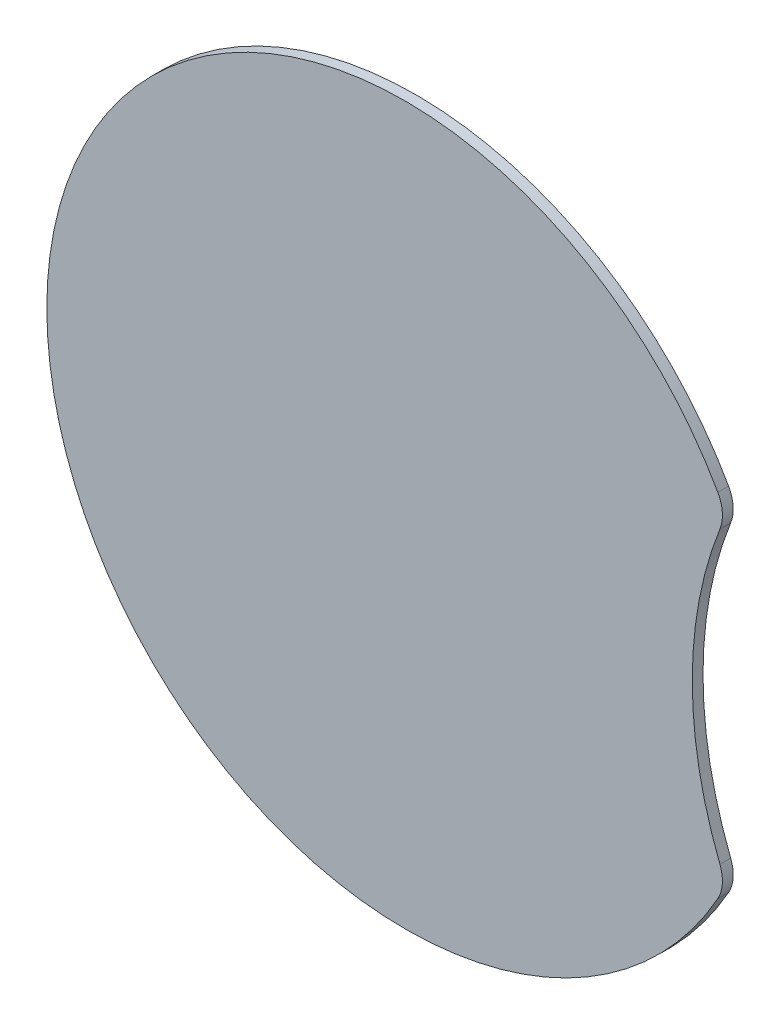
ISO-10303-21;
HEADER;
FILE_DESCRIPTION(('STEP AP214'),'2;1');
FILE_NAME('part.step','',(''),(''),'','','');
FILE_SCHEMA(('AUTOMOTIVE_DESIGN { 1 0 10303 214 1 1 1 1 }'));
ENDSEC;
DATA;
#1=APPLICATION_CONTEXT('core data for automotive mechanical design processes');
#2=APPLICATION_PROTOCOL_DEFINITION('international standard','automotive_design',2000,#1);
#3=PRODUCT_CONTEXT('',#1,'mechanical');
#4=PRODUCT('Part','Part','',(#3));
#5=PRODUCT_RELATED_PRODUCT_CATEGORY('part','',(#4));
#6=PRODUCT_DEFINITION_FORMATION('','',#4);
#7=PRODUCT_DEFINITION_CONTEXT('part definition',#1,'design');
#8=PRODUCT_DEFINITION('design','',#6,#7);
#9=PRODUCT_DEFINITION_SHAPE('','',#8);
#10=(LENGTH_UNIT() NAMED_UNIT(*) SI_UNIT(.MILLI.,.METRE.));
#11=(NAMED_UNIT(*) PLANE_ANGLE_UNIT() SI_UNIT($,.RADIAN.));
#12=(NAMED_UNIT(*) SI_UNIT($,.STERADIAN.) SOLID_ANGLE_UNIT());
#13=UNCERTAINTY_MEASURE_WITH_UNIT(LENGTH_MEASURE(1.E-05),#10,'distance_accuracy_value','');
#14=(GEOMETRIC_REPRESENTATION_CONTEXT(3) GLOBAL_UNCERTAINTY_ASSIGNED_CONTEXT((#13)) GLOBAL_UNIT_ASSIGNED_CONTEXT((#10,
#11,#12)) REPRESENTATION_CONTEXT('',''));
#15=CARTESIAN_POINT('',(0.,0.,0.));
#16=DIRECTION('',(0.,0.,1.));
#17=DIRECTION('',(1.,0.,0.));
#18=AXIS2_PLACEMENT_3D('',#15,#16,#17);
#19=CARTESIAN_POINT('',(0.,0.,3.));
#20=DIRECTION('',(0.,0.,-1.));
#21=DIRECTION('',(-1.,0.,0.));
#22=AXIS2_PLACEMENT_3D('',#19,#20,#21);
#23=CYLINDRICAL_SURFACE('',#22,100.);
#24=CARTESIAN_POINT('',(0.,0.,0.));
#25=DIRECTION('',(0.,0.,1.));
#26=DIRECTION('',(1.,0.,0.));
#27=AXIS2_PLACEMENT_3D('',#24,#25,#26);
#28=CIRCLE('',#27,100.);
#29=CARTESIAN_POINT('',(87.1345029239766,49.0670806161475,0.));
#30=VERTEX_POINT('',#29);
#31=CARTESIAN_POINT('',(87.1345029239766,-49.0670806161475,0.));
#32=VERTEX_POINT('',#31);
#33=EDGE_CURVE('E80',#30,#32,#28,.T.);
#34=ORIENTED_EDGE('',*,*,#33,.T.);
#35=DIRECTION('',(0.,0.,-1.));
#36=VECTOR('',#35,1.);
#37=CARTESIAN_POINT('',(87.1345029239766,-49.0670806161475,3.));
#38=LINE('',#37,#36);
#39=CARTESIAN_POINT('',(87.1345029239766,-49.0670806161475,3.));
#40=VERTEX_POINT('',#39);
#41=EDGE_CURVE('E84',#32,#40,#38,.F.);
#42=ORIENTED_EDGE('',*,*,#41,.T.);
#43=CARTESIAN_POINT('',(0.,0.,3.));
#44=DIRECTION('',(0.,0.,1.));
#45=DIRECTION('',(1.,0.,0.));
#46=AXIS2_PLACEMENT_3D('',#43,#44,#45);
#47=CIRCLE('',#46,100.);
#48=CARTESIAN_POINT('',(87.1345029239766,49.0670806161475,3.));
#49=VERTEX_POINT('',#48);
#50=EDGE_CURVE('E83',#49,#40,#47,.T.);
#51=ORIENTED_EDGE('',*,*,#50,.F.);
#52=DIRECTION('',(0.,0.,-1.));
#53=VECTOR('',#52,1.);
#54=CARTESIAN_POINT('',(87.1345029239766,49.0670806161475,3.));
#55=LINE('',#54,#53);
#56=EDGE_CURVE('E74',#49,#30,#55,.T.);
#57=ORIENTED_EDGE('',*,*,#56,.T.);
#58=EDGE_LOOP('',(#34,#42,#51,#57));
#59=FACE_BOUND('',#58,.T.);
#60=ADVANCED_FACE('F32',(#59),#23,.T.);
#61=CARTESIAN_POINT('',(0.,0.,3.));
#62=DIRECTION('',(0.,0.,1.));
#63=DIRECTION('',(1.,0.,0.));
#64=AXIS2_PLACEMENT_3D('',#61,#62,#63);
#65=PLANE('',#64);
#66=ORIENTED_EDGE('',*,*,#50,.T.);
#67=CARTESIAN_POINT('',(78.4210526315789,-44.1603725545327,3.));
#68=DIRECTION('',(0.,0.,1.));
#69=DIRECTION('',(1.,0.,0.));
#70=AXIS2_PLACEMENT_3D('',#67,#68,#69);
#71=CIRCLE('',#70,10.);
#72=CARTESIAN_POINT('',(87.719298245614,-40.4803415083217,3.));
#73=VERTEX_POINT('',#72);
#74=EDGE_CURVE('E98',#40,#73,#71,.T.);
#75=ORIENTED_EDGE('',*,*,#74,.T.);
#76=CARTESIAN_POINT('',(190.,0.,3.));
#77=DIRECTION('',(0.,0.,1.));
#78=DIRECTION('',(1.,0.,0.));
#79=AXIS2_PLACEMENT_3D('',#76,#77,#78);
#80=CIRCLE('',#79,110.);
#81=CARTESIAN_POINT('',(87.719298245614,40.4803415083217,3.));
#82=VERTEX_POINT('',#81);
#83=EDGE_CURVE('E91',#82,#73,#80,.T.);
#84=ORIENTED_EDGE('',*,*,#83,.F.);
#85=CARTESIAN_POINT('',(78.4210526315789,44.1603725545327,3.));
#86=DIRECTION('',(0.,0.,1.));
#87=DIRECTION('',(1.,0.,0.));
#88=AXIS2_PLACEMENT_3D('',#85,#86,#87);
#89=CIRCLE('',#88,10.);
#90=EDGE_CURVE('E96',#82,#49,#89,.T.);
#91=ORIENTED_EDGE('',*,*,#90,.T.);
#92=EDGE_LOOP('',(#66,#75,#84,#91));
#93=FACE_BOUND('',#92,.T.);
#94=ADVANCED_FACE('F104',(#93),#65,.T.);
#95=CARTESIAN_POINT('',(0.,0.,0.));
#96=DIRECTION('',(0.,0.,1.));
#97=DIRECTION('',(1.,0.,0.));
#98=AXIS2_PLACEMENT_3D('',#95,#96,#97);
#99=PLANE('',#98);
#100=CARTESIAN_POINT('',(190.,0.,0.));
#101=DIRECTION('',(0.,0.,1.));
#102=DIRECTION('',(1.,0.,0.));
#103=AXIS2_PLACEMENT_3D('',#100,#101,#102);
#104=CIRCLE('',#103,110.);
#105=CARTESIAN_POINT('',(87.719298245614,40.4803415083217,0.));
#106=VERTEX_POINT('',#105);
#107=CARTESIAN_POINT('',(87.719298245614,-40.4803415083217,0.));
#108=VERTEX_POINT('',#107);
#109=EDGE_CURVE('E88',#106,#108,#104,.T.);
#110=ORIENTED_EDGE('',*,*,#109,.T.);
#111=CARTESIAN_POINT('',(78.4210526315789,-44.1603725545327,0.));
#112=DIRECTION('',(0.,0.,1.));
#113=DIRECTION('',(1.,0.,0.));
#114=AXIS2_PLACEMENT_3D('',#111,#112,#113);
#115=CIRCLE('',#114,10.);
#116=EDGE_CURVE('E11',#108,#32,#115,.F.);
#117=ORIENTED_EDGE('',*,*,#116,.T.);
#118=ORIENTED_EDGE('',*,*,#33,.F.);
#119=CARTESIAN_POINT('',(78.4210526315789,44.1603725545327,0.));
#120=DIRECTION('',(0.,0.,1.));
#121=DIRECTION('',(1.,0.,0.));
#122=AXIS2_PLACEMENT_3D('',#119,#120,#121);
#123=CIRCLE('',#122,10.);
#124=EDGE_CURVE('E40',#30,#106,#123,.F.);
#125=ORIENTED_EDGE('',*,*,#124,.T.);
#126=EDGE_LOOP('',(#110,#117,#118,#125));
#127=FACE_BOUND('',#126,.T.);
#128=ADVANCED_FACE('F86',(#127),#99,.F.);
#129=CARTESIAN_POINT('',(190.,0.,0.));
#130=DIRECTION('',(0.,0.,1.));
#131=DIRECTION('',(1.,0.,0.));
#132=AXIS2_PLACEMENT_3D('',#129,#130,#131);
#133=CYLINDRICAL_SURFACE('',#132,110.);
#134=ORIENTED_EDGE('',*,*,#83,.T.);
#135=DIRECTION('',(0.,0.,1.));
#136=VECTOR('',#135,1.);
#137=CARTESIAN_POINT('',(87.719298245614,-40.4803415083217,0.));
#138=LINE('',#137,#136);
#139=EDGE_CURVE('E47',#73,#108,#138,.F.);
#140=ORIENTED_EDGE('',*,*,#139,.T.);
#141=ORIENTED_EDGE('',*,*,#109,.F.);
#142=DIRECTION('',(0.,0.,1.));
#143=VECTOR('',#142,1.);
#144=CARTESIAN_POINT('',(87.719298245614,40.4803415083217,0.));
#145=LINE('',#144,#143);
#146=EDGE_CURVE('E75',#106,#82,#145,.T.);
#147=ORIENTED_EDGE('',*,*,#146,.T.);
#148=EDGE_LOOP('',(#134,#140,#141,#147));
#149=FACE_BOUND('',#148,.T.);
#150=ADVANCED_FACE('F102',(#149),#133,.F.);
#151=CARTESIAN_POINT('',(78.4210526315789,-44.1603725545327,0.));
#152=DIRECTION('',(0.,0.,-1.));
#153=DIRECTION('',(-1.,0.,0.));
#154=AXIS2_PLACEMENT_3D('',#151,#152,#153);
#155=CYLINDRICAL_SURFACE('',#154,10.);
#156=ORIENTED_EDGE('',*,*,#116,.F.);
#157=ORIENTED_EDGE('',*,*,#139,.F.);
#158=ORIENTED_EDGE('',*,*,#74,.F.);
#159=ORIENTED_EDGE('',*,*,#41,.F.);
#160=EDGE_LOOP('',(#156,#157,#158,#159));
#161=FACE_BOUND('',#160,.T.);
#162=ADVANCED_FACE('F106',(#161),#155,.T.);
#163=CARTESIAN_POINT('',(78.4210526315789,44.1603725545327,0.));
#164=DIRECTION('',(0.,0.,1.));
#165=DIRECTION('',(1.,0.,0.));
#166=AXIS2_PLACEMENT_3D('',#163,#164,#165);
#167=CYLINDRICAL_SURFACE('',#166,10.);
#168=ORIENTED_EDGE('',*,*,#90,.F.);
#169=ORIENTED_EDGE('',*,*,#146,.F.);
#170=ORIENTED_EDGE('',*,*,#124,.F.);
#171=ORIENTED_EDGE('',*,*,#56,.F.);
#172=EDGE_LOOP('',(#168,#169,#170,#171));
#173=FACE_BOUND('',#172,.T.);
#174=ADVANCED_FACE('F34',(#173),#167,.T.);
#175=CLOSED_SHELL('',(#60,#94,#128,#150,#162,#174));
#176=MANIFOLD_SOLID_BREP('B2',#175);
#177=ADVANCED_BREP_SHAPE_REPRESENTATION('',(#18,#176),#14);
#178=SHAPE_DEFINITION_REPRESENTATION(#9,#177);
ENDSEC;
END-ISO-10303-21;
